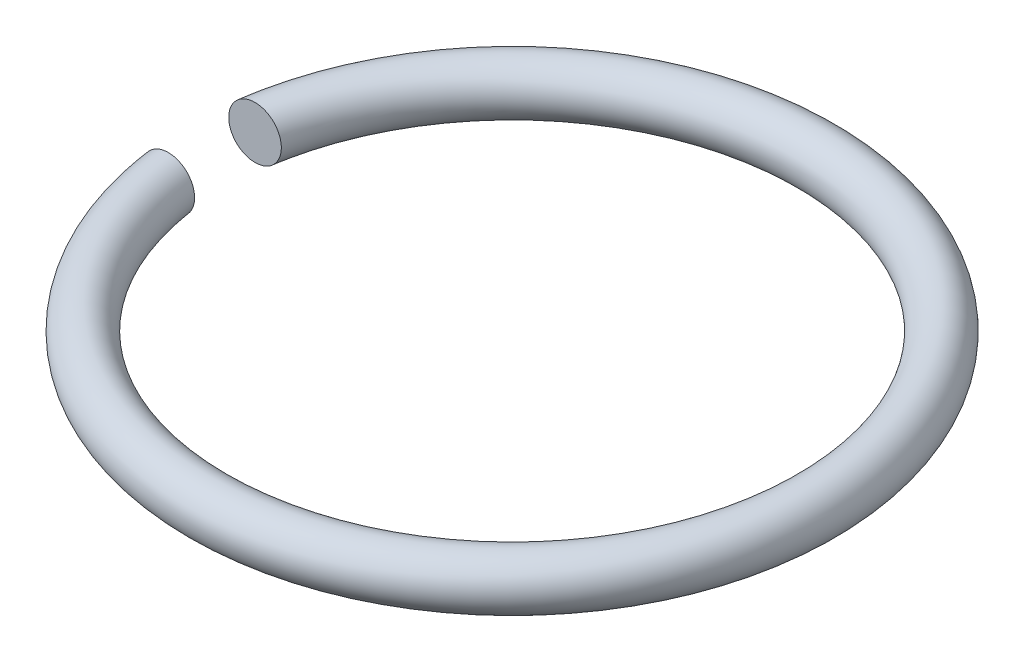
ISO-10303-21;
HEADER;
FILE_DESCRIPTION(('STEP AP214'),'2;1');
FILE_NAME('part.step','',(''),(''),'','','');
FILE_SCHEMA(('AUTOMOTIVE_DESIGN { 1 0 10303 214 1 1 1 1 }'));
ENDSEC;
DATA;
#1=APPLICATION_CONTEXT('core data for automotive mechanical design processes');
#2=APPLICATION_PROTOCOL_DEFINITION('international standard','automotive_design',2000,#1);
#3=PRODUCT_CONTEXT('',#1,'mechanical');
#4=PRODUCT('Part','Part','',(#3));
#5=PRODUCT_RELATED_PRODUCT_CATEGORY('part','',(#4));
#6=PRODUCT_DEFINITION_FORMATION('','',#4);
#7=PRODUCT_DEFINITION_CONTEXT('part definition',#1,'design');
#8=PRODUCT_DEFINITION('design','',#6,#7);
#9=PRODUCT_DEFINITION_SHAPE('','',#8);
#10=(LENGTH_UNIT() NAMED_UNIT(*) SI_UNIT(.MILLI.,.METRE.));
#11=(NAMED_UNIT(*) PLANE_ANGLE_UNIT() SI_UNIT($,.RADIAN.));
#12=(NAMED_UNIT(*) SI_UNIT($,.STERADIAN.) SOLID_ANGLE_UNIT());
#13=UNCERTAINTY_MEASURE_WITH_UNIT(LENGTH_MEASURE(1.E-05),#10,'distance_accuracy_value','');
#14=(GEOMETRIC_REPRESENTATION_CONTEXT(3) GLOBAL_UNCERTAINTY_ASSIGNED_CONTEXT((#13)) GLOBAL_UNIT_ASSIGNED_CONTEXT((#10,
#11,#12)) REPRESENTATION_CONTEXT('',''));
#15=CARTESIAN_POINT('',(0.,0.,0.));
#16=DIRECTION('',(0.,0.,1.));
#17=DIRECTION('',(1.,0.,0.));
#18=AXIS2_PLACEMENT_3D('',#15,#16,#17);
#19=CARTESIAN_POINT('',(0.,0.6,0.));
#20=DIRECTION('',(0.,-1.,0.));
#21=DIRECTION('',(0.,0.,-1.));
#22=AXIS2_PLACEMENT_3D('',#19,#20,#21);
#23=TOROIDAL_SURFACE('',#22,7.,0.6);
#24=CARTESIAN_POINT('',(-7.3973767256529,0.22040943276018,-0.999999999999999));
#25=CARTESIAN_POINT('',(-7.41872626787258,0.246310406406785,-0.999999999999999));
#26=CARTESIAN_POINT('',(-7.43791517788972,0.274022345801123,-0.999999999999999));
#27=CARTESIAN_POINT('',(-7.47138997424171,0.332293536873507,-0.999999999999999));
#28=CARTESIAN_POINT('',(-7.48567043375892,0.362855892851667,-0.999999999999999));
#29=CARTESIAN_POINT('',(-7.50888441044521,0.425944416282537,-0.999999999999999));
#30=CARTESIAN_POINT('',(-7.51781907072869,0.458470162256619,-0.999999999999999));
#31=CARTESIAN_POINT('',(-7.53007481438527,0.524554421198764,-0.999999999999999));
#32=CARTESIAN_POINT('',(-7.53339723824703,0.558112685598321,-0.999999999999999));
#33=CARTESIAN_POINT('',(-7.53433207696544,0.625185630400364,-0.999999999999999));
#34=CARTESIAN_POINT('',(-7.5319653249997,0.658700021531255,-0.999999999999999));
#35=CARTESIAN_POINT('',(-7.52163557338111,0.724855520131101,-0.999999999999999));
#36=CARTESIAN_POINT('',(-7.51367243531217,0.757496605979763,-0.999999999999999));
#37=CARTESIAN_POINT('',(-7.49239087819288,0.820966802298517,-0.999999999999999));
#38=CARTESIAN_POINT('',(-7.47907480575202,0.851796699975144,-0.999999999999999));
#39=CARTESIAN_POINT('',(-7.447478920817,0.910797452662821,-0.999999999999999));
#40=CARTESIAN_POINT('',(-7.42919903326806,0.938968267458842,-0.999999999999999));
#41=CARTESIAN_POINT('',(-7.38811004713064,0.991997329237258,-0.999999999999999));
#42=CARTESIAN_POINT('',(-7.36528019913744,1.016839494899,-0.999999999999999));
#43=CARTESIAN_POINT('',(-7.31580428613225,1.06237651967045,-0.999999999999999));
#44=CARTESIAN_POINT('',(-7.28915807759251,1.0830712227299,-0.999999999999999));
#45=CARTESIAN_POINT('',(-7.23257332181471,1.11990968785836,-0.999999999999999));
#46=CARTESIAN_POINT('',(-7.20260951082932,1.13601464088822,-0.999999999999999));
#47=CARTESIAN_POINT('',(-7.14042079324281,1.16301638251528,-0.999999999999999));
#48=CARTESIAN_POINT('',(-7.10819577346529,1.17391291021059,-0.999999999999999));
#49=CARTESIAN_POINT('',(-7.04209206621674,1.19028660961578,-0.999999999999999));
#50=CARTESIAN_POINT('',(-7.00820121025921,1.19571466833441,-0.999999999999999));
#51=CARTESIAN_POINT('',(-6.93998858146869,1.2008414873761,-0.999999999999999));
#52=CARTESIAN_POINT('',(-6.90566679113239,1.20054001422504,-0.999999999999999));
#53=CARTESIAN_POINT('',(-6.83734753528135,1.19420129196728,-0.999999999999999));
#54=CARTESIAN_POINT('',(-6.80335326857055,1.1881295047313,-0.999999999999999));
#55=CARTESIAN_POINT('',(-6.73686526445267,1.17036613230451,-0.999999999999999));
#56=CARTESIAN_POINT('',(-6.704371546806,1.15867447312993,-0.999999999999999));
#57=CARTESIAN_POINT('',(-6.64181286357574,1.1299875554727,-0.999999999999999));
#58=CARTESIAN_POINT('',(-6.61174802147913,1.11299202754826,-0.999999999999999));
#59=CARTESIAN_POINT('',(-6.55492392336139,1.07416180778774,-0.999999999999999));
#60=CARTESIAN_POINT('',(-6.52816457255402,1.05232725476275,-0.999999999999999));
#61=CARTESIAN_POINT('',(-6.47891667182703,1.00459065051219,-0.999999999999999));
#62=CARTESIAN_POINT('',(-6.45640003219397,0.978717587252529,-0.999999999999999));
#63=CARTESIAN_POINT('',(-6.41608916862489,0.923521850549357,-0.999999999999999));
#64=CARTESIAN_POINT('',(-6.39829464789427,0.894199394074378,-0.999999999999999));
#65=CARTESIAN_POINT('',(-6.36814677046368,0.833289958027259,-0.999999999999999));
#66=CARTESIAN_POINT('',(-6.35573449686571,0.801732139895539,-0.999999999999999));
#67=CARTESIAN_POINT('',(-6.33644536791575,0.736968020664273,-0.999999999999999));
#68=CARTESIAN_POINT('',(-6.32956815539529,0.703761826078608,-0.999999999999999));
#69=CARTESIAN_POINT('',(-6.32160385339265,0.637001830909139,-0.999999999999999));
#70=CARTESIAN_POINT('',(-6.32045924425795,0.603454881901046,-0.999999999999999));
#71=CARTESIAN_POINT('',(-6.32383962056554,0.536648581493324,-0.999999999999999));
#72=CARTESIAN_POINT('',(-6.32836443970023,0.503389221686339,-0.999999999999999));
#73=CARTESIAN_POINT('',(-6.34291926638566,0.438216819838321,-0.999999999999999));
#74=CARTESIAN_POINT('',(-6.35293068695113,0.40629962185328,-0.999999999999999));
#75=CARTESIAN_POINT('',(-6.37814307268426,0.344586383717051,-0.999999999999999));
#76=CARTESIAN_POINT('',(-6.39334412701546,0.314790380020911,-0.999999999999999));
#77=CARTESIAN_POINT('',(-6.42857582222639,0.257993348095901,-0.999999999999999));
#78=CARTESIAN_POINT('',(-6.44863094040241,0.231007509628993,-0.999999999999999));
#79=CARTESIAN_POINT('',(-6.49294267529039,0.180740357990231,-0.999999999999999));
#80=CARTESIAN_POINT('',(-6.5171995217787,0.157459247549356,-0.999999999999999));
#81=CARTESIAN_POINT('',(-6.56950283032656,0.114994543870822,-0.999999999999999));
#82=CARTESIAN_POINT('',(-6.59758716045887,0.095857594965915,-0.999999999999999));
#83=CARTESIAN_POINT('',(-6.65654292570452,0.0625114247461075,-0.999999999999999));
#84=CARTESIAN_POINT('',(-6.68741453295955,0.0483025080482526,-0.999999999999999));
#85=CARTESIAN_POINT('',(-6.75142476824814,0.0250633753488539,-0.999999999999999));
#86=CARTESIAN_POINT('',(-6.78458414606274,0.0160902909214543,-0.999999999999999));
#87=CARTESIAN_POINT('',(-6.85193442895358,0.00380308401715139,-0.999999999999999));
#88=CARTESIAN_POINT('',(-6.88612533498503,0.000488966780697444,-0.999999999999999));
#89=CARTESIAN_POINT('',(-6.95477428834604,-0.000390832286801985,-0.999999999999999));
#90=CARTESIAN_POINT('',(-6.98923275664881,0.00207591953444905,-0.999999999999999));
#91=CARTESIAN_POINT('',(-7.0572548664811,0.0127672394095941,-0.999999999999999));
#92=CARTESIAN_POINT('',(-7.0908182826787,0.0209932434281769,-0.999999999999999));
#93=CARTESIAN_POINT('',(-7.15605277473744,0.0429762614509745,-0.999999999999999));
#94=CARTESIAN_POINT('',(-7.18772519776099,0.0567292826213866,-0.999999999999999));
#95=CARTESIAN_POINT('',(-7.24826017360179,0.089385645202469,-0.999999999999999));
#96=CARTESIAN_POINT('',(-7.27712613182065,0.108282636266332,-0.999999999999999));
#97=CARTESIAN_POINT('',(-7.32128202173898,0.142894396707266,-0.999999999999999));
#98=CARTESIAN_POINT('',(-7.3376682426456,0.157234373791421,-0.999999999999999));
#99=CARTESIAN_POINT('',(-7.36879768978044,0.187599190726447,-0.999999999999999));
#100=CARTESIAN_POINT('',(-7.38354092204257,0.203624024389219,-0.999999999999999));
#101=CARTESIAN_POINT('',(-7.3973767256529,0.22040943276018,-0.999999999999999));
#102=B_SPLINE_CURVE_WITH_KNOTS('',3,(#24,#25,#26,#27,#28,#29,#30,#31,#32,#33,#34,#35,#36,#37,
#38,#39,#40,#41,#42,#43,#44,#45,#46,#47,#48,#49,#50,#51,#52,#53,#54,#55,#56,#57,#58,#59,#60,#61,
#62,#63,#64,#65,#66,#67,#68,#69,#70,#71,#72,#73,#74,#75,#76,#77,#78,#79,#80,#81,#82,#83,#84,#85,
#86,#87,#88,#89,#90,#91,#92,#93,#94,#95,#96,#97,#98,#99,#100,#101),.UNSPECIFIED.,.T.,.F.,(4,2,2,
2,2,2,2,2,2,2,2,2,2,2,2,2,2,2,2,2,2,2,2,2,2,2,2,2,2,2,2,2,2,2,2,2,2,2,4),(0.,0.100618723738503,
0.201348337091775,0.302056403309333,0.402740411895072,0.503056287989101,0.603374645295018,
0.703649073099238,0.803925017175504,0.904669172915355,1.00541711849121,1.10699325329811,
1.20857447575173,1.31106008974447,1.41354987995804,1.51665701064708,1.6197654987447,
1.72287922570832,1.82598999515941,1.92839206948153,2.03078770610327,2.13203228716655,
2.23327033455778,2.33349051806579,2.4337077617732,2.53358757910092,2.63346911255843,
2.7338652089487,2.83426679734942,2.935745641316,3.03723075688904,3.13980347894354,
3.2423762959848,3.3455259759561,3.44870138358547,3.55180238872747,3.65477668611299,
3.71998398656474,3.78519104753316),.UNSPECIFIED.);
#103=CARTESIAN_POINT('',(-7.3973767256529,0.22040943276018,-0.999999999999999));
#104=VERTEX_POINT('',#103);
#105=EDGE_CURVE('E10',#104,#104,#102,.T.);
#106=ORIENTED_EDGE('',*,*,#105,.T.);
#107=EDGE_LOOP('',(#106));
#108=FACE_BOUND('',#107,.T.);
#109=CARTESIAN_POINT('',(-7.3973767256529,0.22040943276018,1.));
#110=CARTESIAN_POINT('',(-7.37575823887221,0.194186959900493,1.));
#111=CARTESIAN_POINT('',(-7.35189300886622,0.169782797983738,1.));
#112=CARTESIAN_POINT('',(-7.30037499275146,0.125318247347126,1.));
#113=CARTESIAN_POINT('',(-7.2727172804706,0.105263597273889,1.));
#114=CARTESIAN_POINT('',(-7.21445571788311,0.0700869003659555,1.));
#115=CARTESIAN_POINT('',(-7.18385443474271,0.0549606050042399,1.));
#116=CARTESIAN_POINT('',(-7.12056787360602,0.0300271474920796,1.));
#117=CARTESIAN_POINT('',(-7.08788311481187,0.0202186658888349,1.));
#118=CARTESIAN_POINT('',(-7.02112008000494,0.00612285097245005,1.));
#119=CARTESIAN_POINT('',(-6.9870340809142,0.00187208910316899,1.));
#120=CARTESIAN_POINT('',(-6.91862885433253,-0.000881322674691446,1.));
#121=CARTESIAN_POINT('',(-6.8843096082792,0.000616490379004233,1.));
#122=CARTESIAN_POINT('',(-6.81621371415322,0.00934068839848899,1.));
#123=CARTESIAN_POINT('',(-6.78244110285432,0.0165986240959159,1.));
#124=CARTESIAN_POINT('',(-6.71659404798312,0.0366844500516189,1.));
#125=CARTESIAN_POINT('',(-6.68451961679957,0.049512380938485,1.));
#126=CARTESIAN_POINT('',(-6.62301055561843,0.0803795684172189,1.));
#127=CARTESIAN_POINT('',(-6.59357416087763,0.0984153065712472,1.));
#128=CARTESIAN_POINT('',(-6.53817654973845,0.139207739567355,1.));
#129=CARTESIAN_POINT('',(-6.51221521145831,0.161964268764215,1.));
#130=CARTESIAN_POINT('',(-6.4647215716503,0.211377212961096,1.));
#131=CARTESIAN_POINT('',(-6.44315747416361,0.238003058327861,1.));
#132=CARTESIAN_POINT('',(-6.40486676864271,0.294532138883949,1.));
#133=CARTESIAN_POINT('',(-6.38813985236297,0.324435165069988,1.));
#134=CARTESIAN_POINT('',(-6.36020066175568,0.386304112236049,1.));
#135=CARTESIAN_POINT('',(-6.34892765391012,0.4182426083985,1.));
#136=CARTESIAN_POINT('',(-6.3319623301249,0.483568666601554,1.));
#137=CARTESIAN_POINT('',(-6.32626966435884,0.516956137670238,1.));
#138=CARTESIAN_POINT('',(-6.32066930497133,0.583889655076762,1.));
#139=CARTESIAN_POINT('',(-6.32070672495284,0.617431119654411,1.));
#140=CARTESIAN_POINT('',(-6.32642804889036,0.684028194707683,1.));
#141=CARTESIAN_POINT('',(-6.33211181324017,0.717083817175274,1.));
#142=CARTESIAN_POINT('',(-6.34892999219799,0.781688893954286,1.));
#143=CARTESIAN_POINT('',(-6.36005083586234,0.813241884758232,1.));
#144=CARTESIAN_POINT('',(-6.38740151769079,0.874048878693202,1.));
#145=CARTESIAN_POINT('',(-6.40363147210906,0.903302829492282,1.));
#146=CARTESIAN_POINT('',(-6.44083171109589,0.95887463215031,1.));
#147=CARTESIAN_POINT('',(-6.46182957702008,0.98517401396326,1.));
#148=CARTESIAN_POINT('',(-6.50789861064411,1.03392252110643,1.));
#149=CARTESIAN_POINT('',(-6.53297000269613,1.05637143422945,1.));
#150=CARTESIAN_POINT('',(-6.58676864368715,1.09704560208746,1.));
#151=CARTESIAN_POINT('',(-6.61553308613207,1.1152216609324,1.));
#152=CARTESIAN_POINT('',(-6.6756808423688,1.14654474775967,1.));
#153=CARTESIAN_POINT('',(-6.70706431009737,1.15969147988252,1.));
#154=CARTESIAN_POINT('',(-6.77190986236986,1.18071718527461,1.));
#155=CARTESIAN_POINT('',(-6.80539013201114,1.18854009980076,1.));
#156=CARTESIAN_POINT('',(-6.87318734625591,1.19848578012776,1.));
#157=CARTESIAN_POINT('',(-6.90750432132452,1.20060833806033,1.));
#158=CARTESIAN_POINT('',(-6.97618452253942,1.19908781560477,1.));
#159=CARTESIAN_POINT('',(-7.01054710995513,1.19541561997378,1.));
#160=CARTESIAN_POINT('',(-7.07816580942262,1.18234380587975,1.));
#161=CARTESIAN_POINT('',(-7.11142192341283,1.1729441974511,1.));
#162=CARTESIAN_POINT('',(-7.17581117054939,1.148690514786,1.));
#163=CARTESIAN_POINT('',(-7.20694819471498,1.13384677586366,1.));
#164=CARTESIAN_POINT('',(-7.26626337834151,1.09910589626259,1.));
#165=CARTESIAN_POINT('',(-7.29444163161873,1.07920891587973,1.));
#166=CARTESIAN_POINT('',(-7.3468177511796,1.03507562716993,1.));
#167=CARTESIAN_POINT('',(-7.37104289234012,1.01087169294126,1.));
#168=CARTESIAN_POINT('',(-7.41504020929375,0.958707388524895,1.));
#169=CARTESIAN_POINT('',(-7.43481259755434,0.930747197672363,1.));
#170=CARTESIAN_POINT('',(-7.46915326549131,0.872137691863181,1.));
#171=CARTESIAN_POINT('',(-7.48376726578141,0.841515163700257,1.));
#172=CARTESIAN_POINT('',(-7.50760212519974,0.778239986963049,1.));
#173=CARTESIAN_POINT('',(-7.51682344403064,0.745587511695543,1.));
#174=CARTESIAN_POINT('',(-7.52954797764869,0.679442427117515,1.));
#175=CARTESIAN_POINT('',(-7.53309368782389,0.645957986113956,1.));
#176=CARTESIAN_POINT('',(-7.53449392717051,0.578861406334696,1.));
#177=CARTESIAN_POINT('',(-7.53234715825033,0.545249240178277,1.));
#178=CARTESIAN_POINT('',(-7.52243968840256,0.478958331050209,1.));
#179=CARTESIAN_POINT('',(-7.51469393264375,0.446277343412308,1.));
#180=CARTESIAN_POINT('',(-7.49383866372239,0.382705098455947,1.));
#181=CARTESIAN_POINT('',(-7.48073569942281,0.351811708357947,1.));
#182=CARTESIAN_POINT('',(-7.45563745940719,0.304173477023476,1.));
#183=CARTESIAN_POINT('',(-7.44518996336731,0.286595229667505,1.));
#184=CARTESIAN_POINT('',(-7.42255788624731,0.252595412521773,1.));
#185=CARTESIAN_POINT('',(-7.41037331095298,0.236173838879693,1.));
#186=CARTESIAN_POINT('',(-7.3973767256529,0.22040943276018,1.));
#187=B_SPLINE_CURVE_WITH_KNOTS('',3,(#109,#110,#111,#112,#113,#114,#115,#116,#117,#118,#119,
#120,#121,#122,#123,#124,#125,#126,#127,#128,#129,#130,#131,#132,#133,#134,#135,#136,#137,#138,
#139,#140,#141,#142,#143,#144,#145,#146,#147,#148,#149,#150,#151,#152,#153,#154,#155,#156,#157,
#158,#159,#160,#161,#162,#163,#164,#165,#166,#167,#168,#169,#170,#171,#172,#173,#174,#175,#176,
#177,#178,#179,#180,#181,#182,#183,#184,#185,#186),.UNSPECIFIED.,.T.,.F.,(4,2,2,2,2,2,2,2,2,2,2,
2,2,2,2,2,2,2,2,2,2,2,2,2,2,2,2,2,2,2,2,2,2,2,2,2,2,2,4),(0.,0.101879433917328,
0.203892478369814,0.305817347550362,0.407716915605609,0.510283693415899,0.612858731629123,
0.715999528891554,0.819141078494952,0.922213107204463,1.02528151988825,1.12757593689619,
1.22986383383629,1.33098484310754,1.43209951279234,1.53224570317646,1.63238941750173,
1.73228443957903,1.83218173486062,1.93267234199851,2.03316848560097,2.13477049854102,
2.23637848748948,2.33904048734934,2.44170623081426,2.54488945414356,2.64807249669677,
2.75106065867091,2.85404555412493,2.95628674387261,3.05852305404741,3.15982900162036,
3.26112631204197,3.36166156321971,3.46221974205108,3.56251049118515,3.66267900578036,
3.72392700971193,3.78517480964646),.UNSPECIFIED.);
#188=CARTESIAN_POINT('',(-7.3973767256529,0.22040943276018,1.));
#189=VERTEX_POINT('',#188);
#190=EDGE_CURVE('E43',#189,#189,#187,.T.);
#191=ORIENTED_EDGE('',*,*,#190,.T.);
#192=EDGE_LOOP('',(#191));
#193=FACE_BOUND('',#192,.T.);
#194=ADVANCED_FACE('F32',(#108,#193),#23,.T.);
#195=CARTESIAN_POINT('',(-12.1619974968585,-1.2E-05,1.));
#196=DIRECTION('',(0.,0.,1.));
#197=DIRECTION('',(1.,0.,0.));
#198=AXIS2_PLACEMENT_3D('',#195,#196,#197);
#199=PLANE('',#198);
#200=ORIENTED_EDGE('',*,*,#190,.F.);
#201=EDGE_LOOP('',(#200));
#202=FACE_BOUND('',#201,.T.);
#203=ADVANCED_FACE('F52',(#202),#199,.F.);
#204=CARTESIAN_POINT('',(-12.1619974968585,-1.2E-05,-0.999999999999999));
#205=DIRECTION('',(0.,0.,-1.));
#206=DIRECTION('',(-1.,0.,0.));
#207=AXIS2_PLACEMENT_3D('',#204,#205,#206);
#208=PLANE('',#207);
#209=ORIENTED_EDGE('',*,*,#105,.F.);
#210=EDGE_LOOP('',(#209));
#211=FACE_BOUND('',#210,.T.);
#212=ADVANCED_FACE('F55',(#211),#208,.F.);
#213=CLOSED_SHELL('',(#194,#203,#212));
#214=MANIFOLD_SOLID_BREP('B2',#213);
#215=ADVANCED_BREP_SHAPE_REPRESENTATION('',(#18,#214),#14);
#216=SHAPE_DEFINITION_REPRESENTATION(#9,#215);
ENDSEC;
END-ISO-10303-21;
